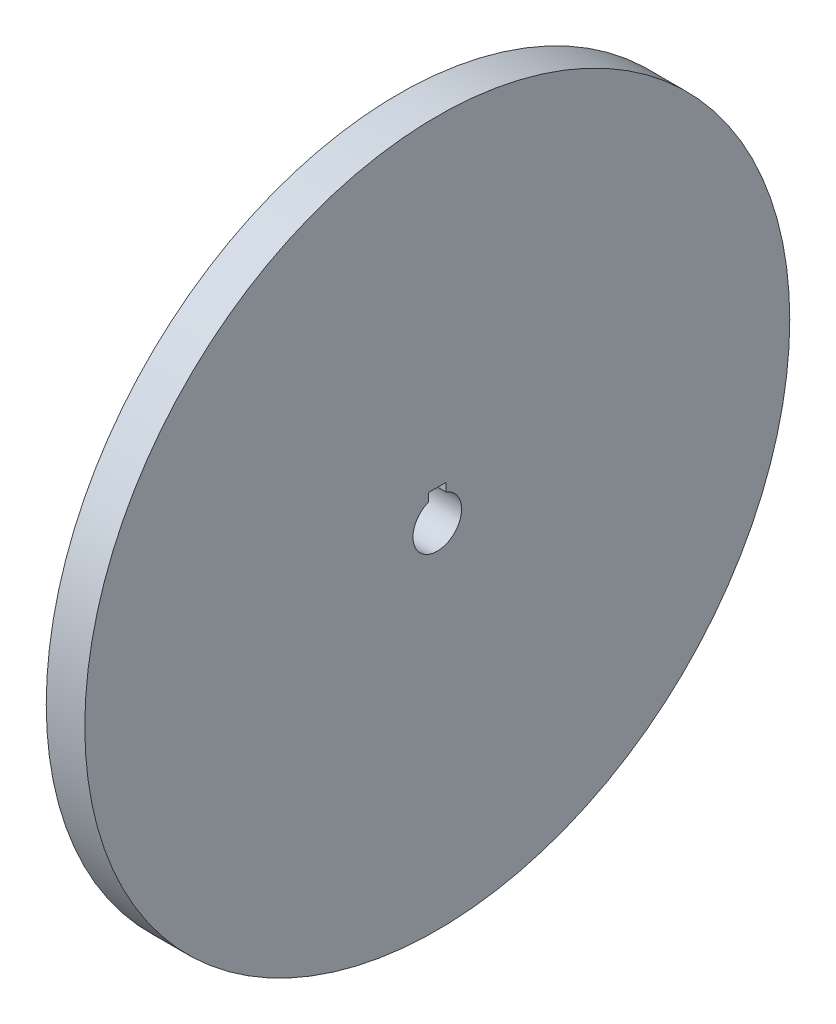
ISO-10303-21;
HEADER;
FILE_DESCRIPTION(('STEP AP214'),'2;1');
FILE_NAME('part.step','',(''),(''),'','','');
FILE_SCHEMA(('AUTOMOTIVE_DESIGN { 1 0 10303 214 1 1 1 1 }'));
ENDSEC;
DATA;
#1=APPLICATION_CONTEXT('core data for automotive mechanical design processes');
#2=APPLICATION_PROTOCOL_DEFINITION('international standard','automotive_design',2000,#1);
#3=PRODUCT_CONTEXT('',#1,'mechanical');
#4=PRODUCT('Part','Part','',(#3));
#5=PRODUCT_RELATED_PRODUCT_CATEGORY('part','',(#4));
#6=PRODUCT_DEFINITION_FORMATION('','',#4);
#7=PRODUCT_DEFINITION_CONTEXT('part definition',#1,'design');
#8=PRODUCT_DEFINITION('design','',#6,#7);
#9=PRODUCT_DEFINITION_SHAPE('','',#8);
#10=(LENGTH_UNIT() NAMED_UNIT(*) SI_UNIT(.MILLI.,.METRE.));
#11=(NAMED_UNIT(*) PLANE_ANGLE_UNIT() SI_UNIT($,.RADIAN.));
#12=(NAMED_UNIT(*) SI_UNIT($,.STERADIAN.) SOLID_ANGLE_UNIT());
#13=UNCERTAINTY_MEASURE_WITH_UNIT(LENGTH_MEASURE(1.E-05),#10,'distance_accuracy_value','');
#14=(GEOMETRIC_REPRESENTATION_CONTEXT(3) GLOBAL_UNCERTAINTY_ASSIGNED_CONTEXT((#13)) GLOBAL_UNIT_ASSIGNED_CONTEXT((#10,
#11,#12)) REPRESENTATION_CONTEXT('',''));
#15=CARTESIAN_POINT('',(0.,0.,0.));
#16=DIRECTION('',(0.,0.,1.));
#17=DIRECTION('',(1.,0.,0.));
#18=AXIS2_PLACEMENT_3D('',#15,#16,#17);
#19=CARTESIAN_POINT('',(5.55625,0.,0.));
#20=DIRECTION('',(1.,0.,0.));
#21=DIRECTION('',(0.,0.,-1.));
#22=AXIS2_PLACEMENT_3D('',#19,#20,#21);
#23=PLANE('',#22);
#24=CARTESIAN_POINT('',(5.55625,0.,0.));
#25=DIRECTION('',(1.,0.,0.));
#26=DIRECTION('',(0.,0.,-1.));
#27=AXIS2_PLACEMENT_3D('',#24,#25,#26);
#28=CIRCLE('',#27,101.6);
#29=CARTESIAN_POINT('',(5.55625,0.,-101.6));
#30=VERTEX_POINT('',#29);
#31=EDGE_CURVE('E11',#30,#30,#28,.T.);
#32=ORIENTED_EDGE('',*,*,#31,.T.);
#33=EDGE_LOOP('',(#32));
#34=FACE_BOUND('',#33,.T.);
#35=DIRECTION('',(0.,0.,1.));
#36=VECTOR('',#35,1.);
#37=CARTESIAN_POINT('',(5.55625,8.90000000000001,2.5));
#38=LINE('',#37,#36);
#39=CARTESIAN_POINT('',(5.55625,8.90000000000001,-2.5));
#40=VERTEX_POINT('',#39);
#41=CARTESIAN_POINT('',(5.55625,8.90000000000001,2.5));
#42=VERTEX_POINT('',#41);
#43=EDGE_CURVE('E88',#40,#42,#38,.T.);
#44=ORIENTED_EDGE('',*,*,#43,.F.);
#45=DIRECTION('',(0.,1.,0.));
#46=VECTOR('',#45,1.);
#47=CARTESIAN_POINT('',(5.55625,6.53834841531101,-2.5));
#48=LINE('',#47,#46);
#49=CARTESIAN_POINT('',(5.55625,6.53834841531101,-2.5));
#50=VERTEX_POINT('',#49);
#51=EDGE_CURVE('E80',#50,#40,#48,.T.);
#52=ORIENTED_EDGE('',*,*,#51,.F.);
#53=CARTESIAN_POINT('',(5.55625,0.,0.));
#54=DIRECTION('',(1.,0.,0.));
#55=DIRECTION('',(0.,0.,-1.));
#56=AXIS2_PLACEMENT_3D('',#53,#54,#55);
#57=CIRCLE('',#56,7.);
#58=CARTESIAN_POINT('',(5.55625,6.53834841531101,2.5));
#59=VERTEX_POINT('',#58);
#60=EDGE_CURVE('E101',#59,#50,#57,.T.);
#61=ORIENTED_EDGE('',*,*,#60,.F.);
#62=DIRECTION('',(0.,-1.,0.));
#63=VECTOR('',#62,1.);
#64=CARTESIAN_POINT('',(5.55625,6.53834841531101,2.5));
#65=LINE('',#64,#63);
#66=EDGE_CURVE('E99',#42,#59,#65,.T.);
#67=ORIENTED_EDGE('',*,*,#66,.F.);
#68=EDGE_LOOP('',(#44,#52,#61,#67));
#69=FACE_BOUND('',#68,.T.);
#70=ADVANCED_FACE('F39',(#34,#69),#23,.T.);
#71=CARTESIAN_POINT('',(-5.55625,0.,0.));
#72=DIRECTION('',(1.,0.,0.));
#73=DIRECTION('',(0.,0.,-1.));
#74=AXIS2_PLACEMENT_3D('',#71,#72,#73);
#75=PLANE('',#74);
#76=CARTESIAN_POINT('',(-5.55625,0.,0.));
#77=DIRECTION('',(1.,0.,0.));
#78=DIRECTION('',(0.,0.,-1.));
#79=AXIS2_PLACEMENT_3D('',#76,#77,#78);
#80=CIRCLE('',#79,101.6);
#81=CARTESIAN_POINT('',(-5.55625,0.,-101.6));
#82=VERTEX_POINT('',#81);
#83=EDGE_CURVE('E43',#82,#82,#80,.T.);
#84=ORIENTED_EDGE('',*,*,#83,.F.);
#85=EDGE_LOOP('',(#84));
#86=FACE_BOUND('',#85,.T.);
#87=DIRECTION('',(0.,1.,0.));
#88=VECTOR('',#87,1.);
#89=CARTESIAN_POINT('',(-5.55625,6.53834841531101,-2.5));
#90=LINE('',#89,#88);
#91=CARTESIAN_POINT('',(-5.55625,6.53834841531101,-2.5));
#92=VERTEX_POINT('',#91);
#93=CARTESIAN_POINT('',(-5.55625,8.90000000000001,-2.5));
#94=VERTEX_POINT('',#93);
#95=EDGE_CURVE('E62',#92,#94,#90,.T.);
#96=ORIENTED_EDGE('',*,*,#95,.T.);
#97=DIRECTION('',(0.,0.,1.));
#98=VECTOR('',#97,1.);
#99=CARTESIAN_POINT('',(-5.55625,8.90000000000001,2.5));
#100=LINE('',#99,#98);
#101=CARTESIAN_POINT('',(-5.55625,8.90000000000001,2.5));
#102=VERTEX_POINT('',#101);
#103=EDGE_CURVE('E95',#94,#102,#100,.T.);
#104=ORIENTED_EDGE('',*,*,#103,.T.);
#105=DIRECTION('',(0.,-1.,0.));
#106=VECTOR('',#105,1.);
#107=CARTESIAN_POINT('',(-5.55625,6.53834841531101,2.5));
#108=LINE('',#107,#106);
#109=CARTESIAN_POINT('',(-5.55625,6.53834841531101,2.5));
#110=VERTEX_POINT('',#109);
#111=EDGE_CURVE('E107',#102,#110,#108,.T.);
#112=ORIENTED_EDGE('',*,*,#111,.T.);
#113=CARTESIAN_POINT('',(-5.55625,0.,0.));
#114=DIRECTION('',(1.,0.,0.));
#115=DIRECTION('',(0.,0.,-1.));
#116=AXIS2_PLACEMENT_3D('',#113,#114,#115);
#117=CIRCLE('',#116,7.);
#118=EDGE_CURVE('E89',#110,#92,#117,.T.);
#119=ORIENTED_EDGE('',*,*,#118,.T.);
#120=EDGE_LOOP('',(#96,#104,#112,#119));
#121=FACE_BOUND('',#120,.T.);
#122=ADVANCED_FACE('F118',(#86,#121),#75,.F.);
#123=CARTESIAN_POINT('',(5.55625,0.,0.));
#124=DIRECTION('',(-1.,0.,0.));
#125=DIRECTION('',(0.,0.,1.));
#126=AXIS2_PLACEMENT_3D('',#123,#124,#125);
#127=CYLINDRICAL_SURFACE('',#126,101.6);
#128=ORIENTED_EDGE('',*,*,#31,.F.);
#129=EDGE_LOOP('',(#128));
#130=FACE_BOUND('',#129,.T.);
#131=ORIENTED_EDGE('',*,*,#83,.T.);
#132=EDGE_LOOP('',(#131));
#133=FACE_BOUND('',#132,.T.);
#134=ADVANCED_FACE('F41',(#130,#133),#127,.T.);
#135=CARTESIAN_POINT('',(5.55625,6.53834841531101,-2.5));
#136=DIRECTION('',(0.,0.,1.));
#137=DIRECTION('',(0.,-1.,0.));
#138=AXIS2_PLACEMENT_3D('',#135,#136,#137);
#139=PLANE('',#138);
#140=ORIENTED_EDGE('',*,*,#95,.F.);
#141=DIRECTION('',(-1.,0.,0.));
#142=VECTOR('',#141,1.);
#143=CARTESIAN_POINT('',(5.55625,6.53834841531101,-2.5));
#144=LINE('',#143,#142);
#145=EDGE_CURVE('E84',#50,#92,#144,.T.);
#146=ORIENTED_EDGE('',*,*,#145,.F.);
#147=ORIENTED_EDGE('',*,*,#51,.T.);
#148=DIRECTION('',(-1.,0.,0.));
#149=VECTOR('',#148,1.);
#150=CARTESIAN_POINT('',(5.55625,8.90000000000001,-2.5));
#151=LINE('',#150,#149);
#152=EDGE_CURVE('E83',#40,#94,#151,.T.);
#153=ORIENTED_EDGE('',*,*,#152,.T.);
#154=EDGE_LOOP('',(#140,#146,#147,#153));
#155=FACE_BOUND('',#154,.T.);
#156=ADVANCED_FACE('F82',(#155),#139,.T.);
#157=CARTESIAN_POINT('',(5.55625,8.90000000000001,2.5));
#158=DIRECTION('',(0.,-1.,0.));
#159=DIRECTION('',(0.,0.,-1.));
#160=AXIS2_PLACEMENT_3D('',#157,#158,#159);
#161=PLANE('',#160);
#162=ORIENTED_EDGE('',*,*,#103,.F.);
#163=ORIENTED_EDGE('',*,*,#152,.F.);
#164=ORIENTED_EDGE('',*,*,#43,.T.);
#165=DIRECTION('',(-1.,0.,0.));
#166=VECTOR('',#165,1.);
#167=CARTESIAN_POINT('',(5.55625,8.90000000000001,2.5));
#168=LINE('',#167,#166);
#169=EDGE_CURVE('E96',#42,#102,#168,.T.);
#170=ORIENTED_EDGE('',*,*,#169,.T.);
#171=EDGE_LOOP('',(#162,#163,#164,#170));
#172=FACE_BOUND('',#171,.T.);
#173=ADVANCED_FACE('F92',(#172),#161,.T.);
#174=CARTESIAN_POINT('',(5.55625,6.53834841531101,2.5));
#175=DIRECTION('',(0.,0.,-1.));
#176=DIRECTION('',(-1.,0.,0.));
#177=AXIS2_PLACEMENT_3D('',#174,#175,#176);
#178=PLANE('',#177);
#179=ORIENTED_EDGE('',*,*,#111,.F.);
#180=ORIENTED_EDGE('',*,*,#169,.F.);
#181=ORIENTED_EDGE('',*,*,#66,.T.);
#182=DIRECTION('',(-1.,0.,0.));
#183=VECTOR('',#182,1.);
#184=CARTESIAN_POINT('',(5.55625,6.53834841531101,2.5));
#185=LINE('',#184,#183);
#186=EDGE_CURVE('E54',#59,#110,#185,.T.);
#187=ORIENTED_EDGE('',*,*,#186,.T.);
#188=EDGE_LOOP('',(#179,#180,#181,#187));
#189=FACE_BOUND('',#188,.T.);
#190=ADVANCED_FACE('F116',(#189),#178,.T.);
#191=CARTESIAN_POINT('',(5.55625,0.,0.));
#192=DIRECTION('',(-1.,0.,0.));
#193=DIRECTION('',(0.,0.,1.));
#194=AXIS2_PLACEMENT_3D('',#191,#192,#193);
#195=CYLINDRICAL_SURFACE('',#194,7.);
#196=ORIENTED_EDGE('',*,*,#118,.F.);
#197=ORIENTED_EDGE('',*,*,#186,.F.);
#198=ORIENTED_EDGE('',*,*,#60,.T.);
#199=ORIENTED_EDGE('',*,*,#145,.T.);
#200=EDGE_LOOP('',(#196,#197,#198,#199));
#201=FACE_BOUND('',#200,.T.);
#202=ADVANCED_FACE('F119',(#201),#195,.F.);
#203=CLOSED_SHELL('',(#70,#122,#134,#156,#173,#190,#202));
#204=MANIFOLD_SOLID_BREP('B2',#203);
#205=ADVANCED_BREP_SHAPE_REPRESENTATION('',(#18,#204),#14);
#206=SHAPE_DEFINITION_REPRESENTATION(#9,#205);
ENDSEC;
END-ISO-10303-21;
